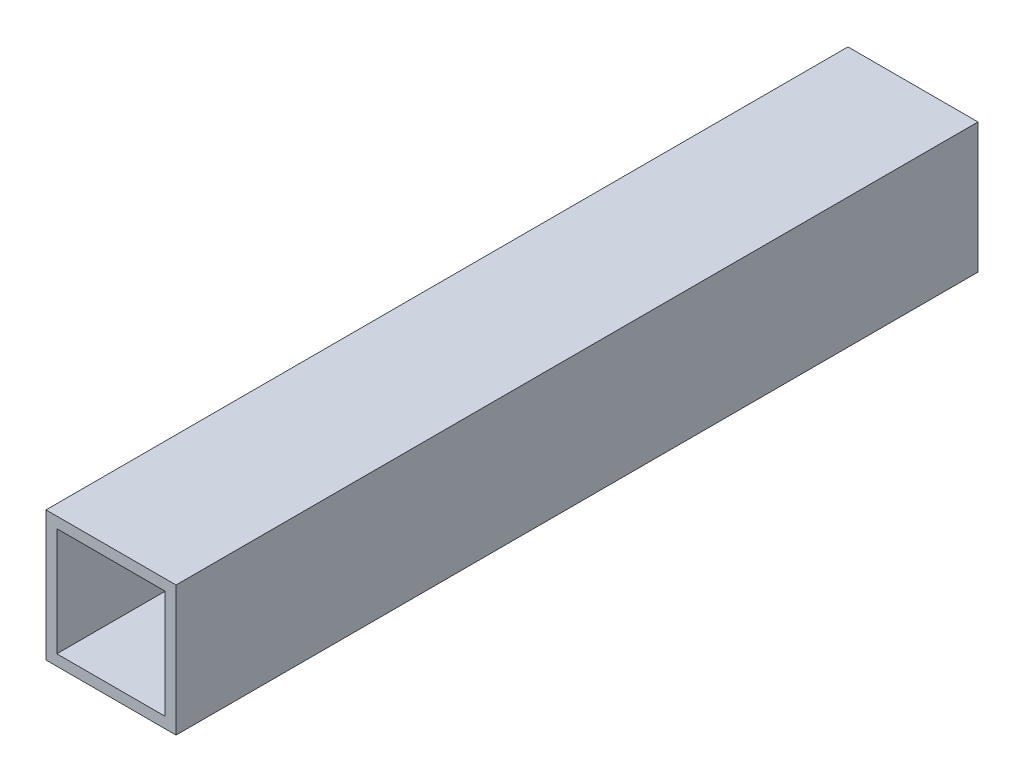
ISO-10303-21;
HEADER;
FILE_DESCRIPTION(('STEP AP214'),'2;1');
FILE_NAME('part.step','',(''),(''),'','','');
FILE_SCHEMA(('AUTOMOTIVE_DESIGN { 1 0 10303 214 1 1 1 1 }'));
ENDSEC;
DATA;
#1=APPLICATION_CONTEXT('core data for automotive mechanical design processes');
#2=APPLICATION_PROTOCOL_DEFINITION('international standard','automotive_design',2000,#1);
#3=PRODUCT_CONTEXT('',#1,'mechanical');
#4=PRODUCT('Part','Part','',(#3));
#5=PRODUCT_RELATED_PRODUCT_CATEGORY('part','',(#4));
#6=PRODUCT_DEFINITION_FORMATION('','',#4);
#7=PRODUCT_DEFINITION_CONTEXT('part definition',#1,'design');
#8=PRODUCT_DEFINITION('design','',#6,#7);
#9=PRODUCT_DEFINITION_SHAPE('','',#8);
#10=(LENGTH_UNIT() NAMED_UNIT(*) SI_UNIT(.MILLI.,.METRE.));
#11=(NAMED_UNIT(*) PLANE_ANGLE_UNIT() SI_UNIT($,.RADIAN.));
#12=(NAMED_UNIT(*) SI_UNIT($,.STERADIAN.) SOLID_ANGLE_UNIT());
#13=UNCERTAINTY_MEASURE_WITH_UNIT(LENGTH_MEASURE(1.E-05),#10,'distance_accuracy_value','');
#14=(GEOMETRIC_REPRESENTATION_CONTEXT(3) GLOBAL_UNCERTAINTY_ASSIGNED_CONTEXT((#13)) GLOBAL_UNIT_ASSIGNED_CONTEXT((#10,
#11,#12)) REPRESENTATION_CONTEXT('',''));
#15=CARTESIAN_POINT('',(0.,0.,0.));
#16=DIRECTION('',(0.,0.,1.));
#17=DIRECTION('',(1.,0.,0.));
#18=AXIS2_PLACEMENT_3D('',#15,#16,#17);
#19=CARTESIAN_POINT('',(0.,0.,148.));
#20=DIRECTION('',(0.,0.,1.));
#21=DIRECTION('',(1.,0.,0.));
#22=AXIS2_PLACEMENT_3D('',#19,#20,#21);
#23=PLANE('',#22);
#24=DIRECTION('',(0.,-1.,0.));
#25=VECTOR('',#24,1.);
#26=CARTESIAN_POINT('',(-12.,12.,148.));
#27=LINE('',#26,#25);
#28=CARTESIAN_POINT('',(-12.,12.,148.));
#29=VERTEX_POINT('',#28);
#30=CARTESIAN_POINT('',(-12.,-12.,148.));
#31=VERTEX_POINT('',#30);
#32=EDGE_CURVE('E136',#29,#31,#27,.T.);
#33=ORIENTED_EDGE('',*,*,#32,.T.);
#34=DIRECTION('',(1.,0.,0.));
#35=VECTOR('',#34,1.);
#36=CARTESIAN_POINT('',(-12.,-12.,148.));
#37=LINE('',#36,#35);
#38=CARTESIAN_POINT('',(12.,-12.,148.));
#39=VERTEX_POINT('',#38);
#40=EDGE_CURVE('E139',#31,#39,#37,.T.);
#41=ORIENTED_EDGE('',*,*,#40,.T.);
#42=DIRECTION('',(0.,1.,0.));
#43=VECTOR('',#42,1.);
#44=CARTESIAN_POINT('',(12.,12.,148.));
#45=LINE('',#44,#43);
#46=CARTESIAN_POINT('',(12.,12.,148.));
#47=VERTEX_POINT('',#46);
#48=EDGE_CURVE('E142',#39,#47,#45,.T.);
#49=ORIENTED_EDGE('',*,*,#48,.T.);
#50=DIRECTION('',(-1.,0.,0.));
#51=VECTOR('',#50,1.);
#52=CARTESIAN_POINT('',(-12.,12.,148.));
#53=LINE('',#52,#51);
#54=EDGE_CURVE('E144',#47,#29,#53,.T.);
#55=ORIENTED_EDGE('',*,*,#54,.T.);
#56=EDGE_LOOP('',(#33,#41,#49,#55));
#57=FACE_BOUND('',#56,.T.);
#58=DIRECTION('',(-1.,0.,0.));
#59=VECTOR('',#58,1.);
#60=CARTESIAN_POINT('',(-10.,10.,148.));
#61=LINE('',#60,#59);
#62=CARTESIAN_POINT('',(10.,10.,148.));
#63=VERTEX_POINT('',#62);
#64=CARTESIAN_POINT('',(-10.,10.,148.));
#65=VERTEX_POINT('',#64);
#66=EDGE_CURVE('E108',#63,#65,#61,.T.);
#67=ORIENTED_EDGE('',*,*,#66,.F.);
#68=DIRECTION('',(0.,1.,0.));
#69=VECTOR('',#68,1.);
#70=CARTESIAN_POINT('',(10.,10.,148.));
#71=LINE('',#70,#69);
#72=CARTESIAN_POINT('',(10.,-10.,148.));
#73=VERTEX_POINT('',#72);
#74=EDGE_CURVE('E100',#73,#63,#71,.T.);
#75=ORIENTED_EDGE('',*,*,#74,.F.);
#76=DIRECTION('',(1.,0.,0.));
#77=VECTOR('',#76,1.);
#78=CARTESIAN_POINT('',(-10.,-10.,148.));
#79=LINE('',#78,#77);
#80=CARTESIAN_POINT('',(-10.,-10.,148.));
#81=VERTEX_POINT('',#80);
#82=EDGE_CURVE('E122',#81,#73,#79,.T.);
#83=ORIENTED_EDGE('',*,*,#82,.F.);
#84=DIRECTION('',(0.,-1.,0.));
#85=VECTOR('',#84,1.);
#86=CARTESIAN_POINT('',(-10.,10.,148.));
#87=LINE('',#86,#85);
#88=EDGE_CURVE('E120',#65,#81,#87,.T.);
#89=ORIENTED_EDGE('',*,*,#88,.F.);
#90=EDGE_LOOP('',(#67,#75,#83,#89));
#91=FACE_BOUND('',#90,.T.);
#92=ADVANCED_FACE('F35',(#57,#91),#23,.T.);
#93=CARTESIAN_POINT('',(0.,0.,0.));
#94=DIRECTION('',(0.,0.,1.));
#95=DIRECTION('',(1.,0.,0.));
#96=AXIS2_PLACEMENT_3D('',#93,#94,#95);
#97=PLANE('',#96);
#98=DIRECTION('',(0.,-1.,0.));
#99=VECTOR('',#98,1.);
#100=CARTESIAN_POINT('',(-12.,12.,0.));
#101=LINE('',#100,#99);
#102=CARTESIAN_POINT('',(-12.,12.,0.));
#103=VERTEX_POINT('',#102);
#104=CARTESIAN_POINT('',(-12.,-12.,0.));
#105=VERTEX_POINT('',#104);
#106=EDGE_CURVE('E116',#103,#105,#101,.T.);
#107=ORIENTED_EDGE('',*,*,#106,.F.);
#108=DIRECTION('',(-1.,0.,0.));
#109=VECTOR('',#108,1.);
#110=CARTESIAN_POINT('',(-12.,12.,0.));
#111=LINE('',#110,#109);
#112=CARTESIAN_POINT('',(12.,12.,0.));
#113=VERTEX_POINT('',#112);
#114=EDGE_CURVE('E140',#113,#103,#111,.T.);
#115=ORIENTED_EDGE('',*,*,#114,.F.);
#116=DIRECTION('',(0.,1.,0.));
#117=VECTOR('',#116,1.);
#118=CARTESIAN_POINT('',(12.,12.,0.));
#119=LINE('',#118,#117);
#120=CARTESIAN_POINT('',(12.,-12.,0.));
#121=VERTEX_POINT('',#120);
#122=EDGE_CURVE('E151',#121,#113,#119,.T.);
#123=ORIENTED_EDGE('',*,*,#122,.F.);
#124=DIRECTION('',(1.,0.,0.));
#125=VECTOR('',#124,1.);
#126=CARTESIAN_POINT('',(-12.,-12.,0.));
#127=LINE('',#126,#125);
#128=EDGE_CURVE('E149',#105,#121,#127,.T.);
#129=ORIENTED_EDGE('',*,*,#128,.F.);
#130=EDGE_LOOP('',(#107,#115,#123,#129));
#131=FACE_BOUND('',#130,.T.);
#132=DIRECTION('',(0.,1.,0.));
#133=VECTOR('',#132,1.);
#134=CARTESIAN_POINT('',(10.,10.,0.));
#135=LINE('',#134,#133);
#136=CARTESIAN_POINT('',(10.,-10.,0.));
#137=VERTEX_POINT('',#136);
#138=CARTESIAN_POINT('',(10.,10.,0.));
#139=VERTEX_POINT('',#138);
#140=EDGE_CURVE('E58',#137,#139,#135,.T.);
#141=ORIENTED_EDGE('',*,*,#140,.T.);
#142=DIRECTION('',(-1.,0.,0.));
#143=VECTOR('',#142,1.);
#144=CARTESIAN_POINT('',(-10.,10.,0.));
#145=LINE('',#144,#143);
#146=CARTESIAN_POINT('',(-10.,10.,0.));
#147=VERTEX_POINT('',#146);
#148=EDGE_CURVE('E115',#139,#147,#145,.T.);
#149=ORIENTED_EDGE('',*,*,#148,.T.);
#150=DIRECTION('',(0.,-1.,0.));
#151=VECTOR('',#150,1.);
#152=CARTESIAN_POINT('',(-10.,10.,0.));
#153=LINE('',#152,#151);
#154=CARTESIAN_POINT('',(-10.,-10.,0.));
#155=VERTEX_POINT('',#154);
#156=EDGE_CURVE('E128',#147,#155,#153,.T.);
#157=ORIENTED_EDGE('',*,*,#156,.T.);
#158=DIRECTION('',(1.,0.,0.));
#159=VECTOR('',#158,1.);
#160=CARTESIAN_POINT('',(-10.,-10.,0.));
#161=LINE('',#160,#159);
#162=EDGE_CURVE('E109',#155,#137,#161,.T.);
#163=ORIENTED_EDGE('',*,*,#162,.T.);
#164=EDGE_LOOP('',(#141,#149,#157,#163));
#165=FACE_BOUND('',#164,.T.);
#166=ADVANCED_FACE('F169',(#131,#165),#97,.F.);
#167=CARTESIAN_POINT('',(-12.,12.,148.));
#168=DIRECTION('',(1.,0.,0.));
#169=DIRECTION('',(0.,1.,0.));
#170=AXIS2_PLACEMENT_3D('',#167,#168,#169);
#171=PLANE('',#170);
#172=ORIENTED_EDGE('',*,*,#106,.T.);
#173=DIRECTION('',(0.,0.,-1.));
#174=VECTOR('',#173,1.);
#175=CARTESIAN_POINT('',(-12.,-12.,148.));
#176=LINE('',#175,#174);
#177=EDGE_CURVE('E11',#31,#105,#176,.T.);
#178=ORIENTED_EDGE('',*,*,#177,.F.);
#179=ORIENTED_EDGE('',*,*,#32,.F.);
#180=DIRECTION('',(0.,0.,-1.));
#181=VECTOR('',#180,1.);
#182=CARTESIAN_POINT('',(-12.,12.,148.));
#183=LINE('',#182,#181);
#184=EDGE_CURVE('E146',#29,#103,#183,.T.);
#185=ORIENTED_EDGE('',*,*,#184,.T.);
#186=EDGE_LOOP('',(#172,#178,#179,#185));
#187=FACE_BOUND('',#186,.T.);
#188=ADVANCED_FACE('F37',(#187),#171,.F.);
#189=CARTESIAN_POINT('',(-12.,-12.,148.));
#190=DIRECTION('',(0.,1.,0.));
#191=DIRECTION('',(-1.,0.,0.));
#192=AXIS2_PLACEMENT_3D('',#189,#190,#191);
#193=PLANE('',#192);
#194=ORIENTED_EDGE('',*,*,#128,.T.);
#195=DIRECTION('',(0.,0.,-1.));
#196=VECTOR('',#195,1.);
#197=CARTESIAN_POINT('',(12.,-12.,148.));
#198=LINE('',#197,#196);
#199=EDGE_CURVE('E43',#39,#121,#198,.T.);
#200=ORIENTED_EDGE('',*,*,#199,.F.);
#201=ORIENTED_EDGE('',*,*,#40,.F.);
#202=ORIENTED_EDGE('',*,*,#177,.T.);
#203=EDGE_LOOP('',(#194,#200,#201,#202));
#204=FACE_BOUND('',#203,.T.);
#205=ADVANCED_FACE('F179',(#204),#193,.F.);
#206=CARTESIAN_POINT('',(12.,12.,148.));
#207=DIRECTION('',(-1.,0.,0.));
#208=DIRECTION('',(0.,-1.,0.));
#209=AXIS2_PLACEMENT_3D('',#206,#207,#208);
#210=PLANE('',#209);
#211=ORIENTED_EDGE('',*,*,#122,.T.);
#212=DIRECTION('',(0.,0.,-1.));
#213=VECTOR('',#212,1.);
#214=CARTESIAN_POINT('',(12.,12.,148.));
#215=LINE('',#214,#213);
#216=EDGE_CURVE('E156',#47,#113,#215,.T.);
#217=ORIENTED_EDGE('',*,*,#216,.F.);
#218=ORIENTED_EDGE('',*,*,#48,.F.);
#219=ORIENTED_EDGE('',*,*,#199,.T.);
#220=EDGE_LOOP('',(#211,#217,#218,#219));
#221=FACE_BOUND('',#220,.T.);
#222=ADVANCED_FACE('F163',(#221),#210,.F.);
#223=CARTESIAN_POINT('',(-12.,12.,148.));
#224=DIRECTION('',(0.,-1.,0.));
#225=DIRECTION('',(0.,0.,-1.));
#226=AXIS2_PLACEMENT_3D('',#223,#224,#225);
#227=PLANE('',#226);
#228=ORIENTED_EDGE('',*,*,#114,.T.);
#229=ORIENTED_EDGE('',*,*,#184,.F.);
#230=ORIENTED_EDGE('',*,*,#54,.F.);
#231=ORIENTED_EDGE('',*,*,#216,.T.);
#232=EDGE_LOOP('',(#228,#229,#230,#231));
#233=FACE_BOUND('',#232,.T.);
#234=ADVANCED_FACE('F173',(#233),#227,.F.);
#235=CARTESIAN_POINT('',(10.,10.,148.));
#236=DIRECTION('',(-1.,0.,0.));
#237=DIRECTION('',(0.,0.,1.));
#238=AXIS2_PLACEMENT_3D('',#235,#236,#237);
#239=PLANE('',#238);
#240=ORIENTED_EDGE('',*,*,#140,.F.);
#241=DIRECTION('',(0.,0.,-1.));
#242=VECTOR('',#241,1.);
#243=CARTESIAN_POINT('',(10.,-10.,148.));
#244=LINE('',#243,#242);
#245=EDGE_CURVE('E104',#73,#137,#244,.T.);
#246=ORIENTED_EDGE('',*,*,#245,.F.);
#247=ORIENTED_EDGE('',*,*,#74,.T.);
#248=DIRECTION('',(0.,0.,-1.));
#249=VECTOR('',#248,1.);
#250=CARTESIAN_POINT('',(10.,10.,148.));
#251=LINE('',#250,#249);
#252=EDGE_CURVE('E103',#63,#139,#251,.T.);
#253=ORIENTED_EDGE('',*,*,#252,.T.);
#254=EDGE_LOOP('',(#240,#246,#247,#253));
#255=FACE_BOUND('',#254,.T.);
#256=ADVANCED_FACE('F102',(#255),#239,.T.);
#257=CARTESIAN_POINT('',(-10.,10.,148.));
#258=DIRECTION('',(0.,-1.,0.));
#259=DIRECTION('',(0.,0.,-1.));
#260=AXIS2_PLACEMENT_3D('',#257,#258,#259);
#261=PLANE('',#260);
#262=ORIENTED_EDGE('',*,*,#148,.F.);
#263=ORIENTED_EDGE('',*,*,#252,.F.);
#264=ORIENTED_EDGE('',*,*,#66,.T.);
#265=DIRECTION('',(0.,0.,-1.));
#266=VECTOR('',#265,1.);
#267=CARTESIAN_POINT('',(-10.,10.,148.));
#268=LINE('',#267,#266);
#269=EDGE_CURVE('E117',#65,#147,#268,.T.);
#270=ORIENTED_EDGE('',*,*,#269,.T.);
#271=EDGE_LOOP('',(#262,#263,#264,#270));
#272=FACE_BOUND('',#271,.T.);
#273=ADVANCED_FACE('F112',(#272),#261,.T.);
#274=CARTESIAN_POINT('',(-10.,10.,148.));
#275=DIRECTION('',(1.,0.,0.));
#276=DIRECTION('',(0.,1.,0.));
#277=AXIS2_PLACEMENT_3D('',#274,#275,#276);
#278=PLANE('',#277);
#279=ORIENTED_EDGE('',*,*,#156,.F.);
#280=ORIENTED_EDGE('',*,*,#269,.F.);
#281=ORIENTED_EDGE('',*,*,#88,.T.);
#282=DIRECTION('',(0.,0.,-1.));
#283=VECTOR('',#282,1.);
#284=CARTESIAN_POINT('',(-10.,-10.,148.));
#285=LINE('',#284,#283);
#286=EDGE_CURVE('E50',#81,#155,#285,.T.);
#287=ORIENTED_EDGE('',*,*,#286,.T.);
#288=EDGE_LOOP('',(#279,#280,#281,#287));
#289=FACE_BOUND('',#288,.T.);
#290=ADVANCED_FACE('F202',(#289),#278,.T.);
#291=CARTESIAN_POINT('',(-10.,-10.,148.));
#292=DIRECTION('',(0.,1.,0.));
#293=DIRECTION('',(0.,0.,1.));
#294=AXIS2_PLACEMENT_3D('',#291,#292,#293);
#295=PLANE('',#294);
#296=ORIENTED_EDGE('',*,*,#162,.F.);
#297=ORIENTED_EDGE('',*,*,#286,.F.);
#298=ORIENTED_EDGE('',*,*,#82,.T.);
#299=ORIENTED_EDGE('',*,*,#245,.T.);
#300=EDGE_LOOP('',(#296,#297,#298,#299));
#301=FACE_BOUND('',#300,.T.);
#302=ADVANCED_FACE('F206',(#301),#295,.T.);
#303=CLOSED_SHELL('',(#92,#166,#188,#205,#222,#234,#256,#273,#290,#302));
#304=MANIFOLD_SOLID_BREP('B2',#303);
#305=ADVANCED_BREP_SHAPE_REPRESENTATION('',(#18,#304),#14);
#306=SHAPE_DEFINITION_REPRESENTATION(#9,#305);
ENDSEC;
END-ISO-10303-21;
